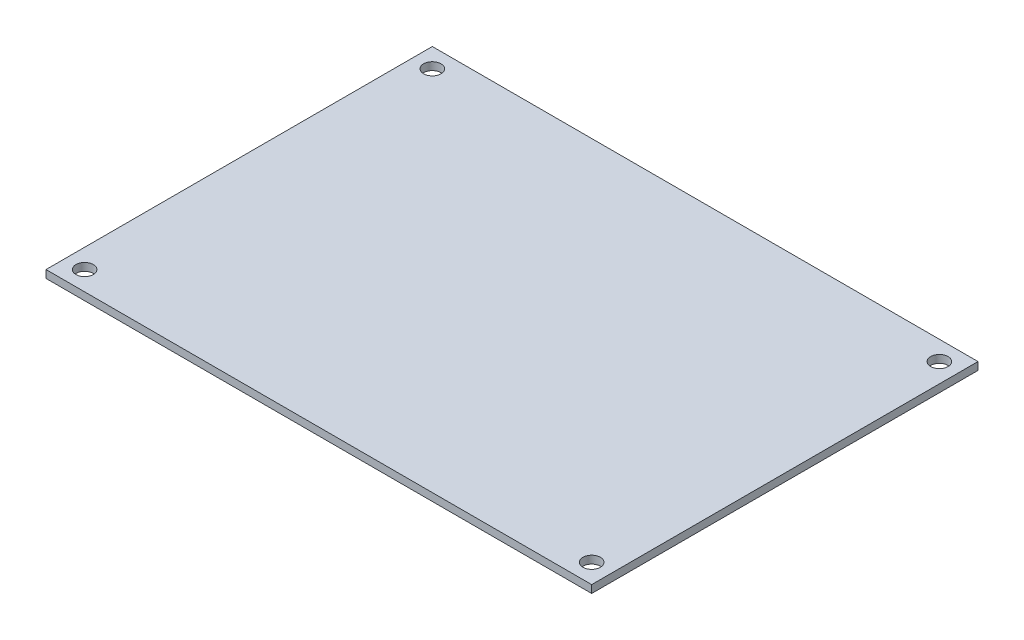
ISO-10303-21;
HEADER;
FILE_DESCRIPTION(('STEP AP214'),'2;1');
FILE_NAME('part.step','',(''),(''),'','','');
FILE_SCHEMA(('AUTOMOTIVE_DESIGN { 1 0 10303 214 1 1 1 1 }'));
ENDSEC;
DATA;
#1=APPLICATION_CONTEXT('core data for automotive mechanical design processes');
#2=APPLICATION_PROTOCOL_DEFINITION('international standard','automotive_design',2000,#1);
#3=PRODUCT_CONTEXT('',#1,'mechanical');
#4=PRODUCT('Part','Part','',(#3));
#5=PRODUCT_RELATED_PRODUCT_CATEGORY('part','',(#4));
#6=PRODUCT_DEFINITION_FORMATION('','',#4);
#7=PRODUCT_DEFINITION_CONTEXT('part definition',#1,'design');
#8=PRODUCT_DEFINITION('design','',#6,#7);
#9=PRODUCT_DEFINITION_SHAPE('','',#8);
#10=(LENGTH_UNIT() NAMED_UNIT(*) SI_UNIT(.MILLI.,.METRE.));
#11=(NAMED_UNIT(*) PLANE_ANGLE_UNIT() SI_UNIT($,.RADIAN.));
#12=(NAMED_UNIT(*) SI_UNIT($,.STERADIAN.) SOLID_ANGLE_UNIT());
#13=UNCERTAINTY_MEASURE_WITH_UNIT(LENGTH_MEASURE(1.E-05),#10,'distance_accuracy_value','');
#14=(GEOMETRIC_REPRESENTATION_CONTEXT(3) GLOBAL_UNCERTAINTY_ASSIGNED_CONTEXT((#13)) GLOBAL_UNIT_ASSIGNED_CONTEXT((#10,
#11,#12)) REPRESENTATION_CONTEXT('',''));
#15=CARTESIAN_POINT('',(0.,0.,0.));
#16=DIRECTION('',(0.,0.,1.));
#17=DIRECTION('',(1.,0.,0.));
#18=AXIS2_PLACEMENT_3D('',#15,#16,#17);
#19=CARTESIAN_POINT('',(56.5,1.6,-40.));
#20=DIRECTION('',(-1.,0.,0.));
#21=DIRECTION('',(0.,0.,1.));
#22=AXIS2_PLACEMENT_3D('',#19,#20,#21);
#23=PLANE('',#22);
#24=DIRECTION('',(0.,0.,-1.));
#25=VECTOR('',#24,1.);
#26=CARTESIAN_POINT('',(56.5,0.,-40.));
#27=LINE('',#26,#25);
#28=CARTESIAN_POINT('',(56.5,0.,40.));
#29=VERTEX_POINT('',#28);
#30=CARTESIAN_POINT('',(56.5,0.,-40.));
#31=VERTEX_POINT('',#30);
#32=EDGE_CURVE('E96',#29,#31,#27,.T.);
#33=ORIENTED_EDGE('',*,*,#32,.T.);
#34=DIRECTION('',(0.,-1.,0.));
#35=VECTOR('',#34,1.);
#36=CARTESIAN_POINT('',(56.5,1.6,-40.));
#37=LINE('',#36,#35);
#38=CARTESIAN_POINT('',(56.5,1.6,-40.));
#39=VERTEX_POINT('',#38);
#40=EDGE_CURVE('E11',#39,#31,#37,.T.);
#41=ORIENTED_EDGE('',*,*,#40,.F.);
#42=DIRECTION('',(0.,0.,-1.));
#43=VECTOR('',#42,1.);
#44=CARTESIAN_POINT('',(56.5,1.6,-40.));
#45=LINE('',#44,#43);
#46=CARTESIAN_POINT('',(56.5,1.6,40.));
#47=VERTEX_POINT('',#46);
#48=EDGE_CURVE('E84',#47,#39,#45,.T.);
#49=ORIENTED_EDGE('',*,*,#48,.F.);
#50=DIRECTION('',(0.,-1.,0.));
#51=VECTOR('',#50,1.);
#52=CARTESIAN_POINT('',(56.5,1.6,40.));
#53=LINE('',#52,#51);
#54=EDGE_CURVE('E92',#47,#29,#53,.T.);
#55=ORIENTED_EDGE('',*,*,#54,.T.);
#56=EDGE_LOOP('',(#33,#41,#49,#55));
#57=FACE_BOUND('',#56,.T.);
#58=ADVANCED_FACE('F33',(#57),#23,.F.);
#59=CARTESIAN_POINT('',(-56.5,1.6,-40.));
#60=DIRECTION('',(0.,0.,1.));
#61=DIRECTION('',(1.,0.,0.));
#62=AXIS2_PLACEMENT_3D('',#59,#60,#61);
#63=PLANE('',#62);
#64=DIRECTION('',(-1.,0.,0.));
#65=VECTOR('',#64,1.);
#66=CARTESIAN_POINT('',(-56.5,0.,-40.));
#67=LINE('',#66,#65);
#68=CARTESIAN_POINT('',(-56.5,0.,-40.));
#69=VERTEX_POINT('',#68);
#70=EDGE_CURVE('E88',#31,#69,#67,.T.);
#71=ORIENTED_EDGE('',*,*,#70,.T.);
#72=DIRECTION('',(0.,-1.,0.));
#73=VECTOR('',#72,1.);
#74=CARTESIAN_POINT('',(-56.5,1.6,-40.));
#75=LINE('',#74,#73);
#76=CARTESIAN_POINT('',(-56.5,1.6,-40.));
#77=VERTEX_POINT('',#76);
#78=EDGE_CURVE('E41',#77,#69,#75,.T.);
#79=ORIENTED_EDGE('',*,*,#78,.F.);
#80=DIRECTION('',(-1.,0.,0.));
#81=VECTOR('',#80,1.);
#82=CARTESIAN_POINT('',(-56.5,1.6,-40.));
#83=LINE('',#82,#81);
#84=EDGE_CURVE('E79',#39,#77,#83,.T.);
#85=ORIENTED_EDGE('',*,*,#84,.F.);
#86=ORIENTED_EDGE('',*,*,#40,.T.);
#87=EDGE_LOOP('',(#71,#79,#85,#86));
#88=FACE_BOUND('',#87,.T.);
#89=ADVANCED_FACE('F87',(#88),#63,.F.);
#90=CARTESIAN_POINT('',(-56.5,1.6,-40.));
#91=DIRECTION('',(1.,0.,0.));
#92=DIRECTION('',(0.,0.,-1.));
#93=AXIS2_PLACEMENT_3D('',#90,#91,#92);
#94=PLANE('',#93);
#95=DIRECTION('',(0.,0.,1.));
#96=VECTOR('',#95,1.);
#97=CARTESIAN_POINT('',(-56.5,0.,-40.));
#98=LINE('',#97,#96);
#99=CARTESIAN_POINT('',(-56.5,0.,40.));
#100=VERTEX_POINT('',#99);
#101=EDGE_CURVE('E66',#69,#100,#98,.T.);
#102=ORIENTED_EDGE('',*,*,#101,.T.);
#103=DIRECTION('',(0.,-1.,0.));
#104=VECTOR('',#103,1.);
#105=CARTESIAN_POINT('',(-56.5,1.6,40.));
#106=LINE('',#105,#104);
#107=CARTESIAN_POINT('',(-56.5,1.6,40.));
#108=VERTEX_POINT('',#107);
#109=EDGE_CURVE('E89',#108,#100,#106,.T.);
#110=ORIENTED_EDGE('',*,*,#109,.F.);
#111=DIRECTION('',(0.,0.,1.));
#112=VECTOR('',#111,1.);
#113=CARTESIAN_POINT('',(-56.5,1.6,-40.));
#114=LINE('',#113,#112);
#115=EDGE_CURVE('E82',#77,#108,#114,.T.);
#116=ORIENTED_EDGE('',*,*,#115,.F.);
#117=ORIENTED_EDGE('',*,*,#78,.T.);
#118=EDGE_LOOP('',(#102,#110,#116,#117));
#119=FACE_BOUND('',#118,.T.);
#120=ADVANCED_FACE('F90',(#119),#94,.F.);
#121=CARTESIAN_POINT('',(-56.5,1.6,40.));
#122=DIRECTION('',(0.,0.,-1.));
#123=DIRECTION('',(-1.,0.,0.));
#124=AXIS2_PLACEMENT_3D('',#121,#122,#123);
#125=PLANE('',#124);
#126=DIRECTION('',(1.,0.,0.));
#127=VECTOR('',#126,1.);
#128=CARTESIAN_POINT('',(-56.5,0.,40.));
#129=LINE('',#128,#127);
#130=EDGE_CURVE('E72',#100,#29,#129,.T.);
#131=ORIENTED_EDGE('',*,*,#130,.T.);
#132=ORIENTED_EDGE('',*,*,#54,.F.);
#133=DIRECTION('',(1.,0.,0.));
#134=VECTOR('',#133,1.);
#135=CARTESIAN_POINT('',(-56.5,1.6,40.));
#136=LINE('',#135,#134);
#137=EDGE_CURVE('E49',#108,#47,#136,.T.);
#138=ORIENTED_EDGE('',*,*,#137,.F.);
#139=ORIENTED_EDGE('',*,*,#109,.T.);
#140=EDGE_LOOP('',(#131,#132,#138,#139));
#141=FACE_BOUND('',#140,.T.);
#142=ADVANCED_FACE('F104',(#141),#125,.F.);
#143=CARTESIAN_POINT('',(0.,1.6,0.));
#144=DIRECTION('',(0.,1.,0.));
#145=DIRECTION('',(0.,0.,1.));
#146=AXIS2_PLACEMENT_3D('',#143,#144,#145);
#147=PLANE('',#146);
#148=CARTESIAN_POINT('',(52.5,1.6,36.));
#149=DIRECTION('',(0.,1.,0.));
#150=DIRECTION('',(0.,0.,1.));
#151=AXIS2_PLACEMENT_3D('',#148,#149,#150);
#152=CIRCLE('',#151,1.8);
#153=CARTESIAN_POINT('',(52.5,1.6,37.8));
#154=VERTEX_POINT('',#153);
#155=EDGE_CURVE('E130',#154,#154,#152,.T.);
#156=ORIENTED_EDGE('',*,*,#155,.F.);
#157=EDGE_LOOP('',(#156));
#158=FACE_BOUND('',#157,.T.);
#159=CARTESIAN_POINT('',(-52.5,1.6,36.));
#160=DIRECTION('',(0.,1.,0.));
#161=DIRECTION('',(0.,0.,1.));
#162=AXIS2_PLACEMENT_3D('',#159,#160,#161);
#163=CIRCLE('',#162,1.8);
#164=CARTESIAN_POINT('',(-52.5,1.6,37.8));
#165=VERTEX_POINT('',#164);
#166=EDGE_CURVE('E124',#165,#165,#163,.T.);
#167=ORIENTED_EDGE('',*,*,#166,.F.);
#168=EDGE_LOOP('',(#167));
#169=FACE_BOUND('',#168,.T.);
#170=CARTESIAN_POINT('',(52.5,1.6,-36.));
#171=DIRECTION('',(0.,1.,0.));
#172=DIRECTION('',(0.,0.,1.));
#173=AXIS2_PLACEMENT_3D('',#170,#171,#172);
#174=CIRCLE('',#173,1.8);
#175=CARTESIAN_POINT('',(52.5,1.6,-34.2));
#176=VERTEX_POINT('',#175);
#177=EDGE_CURVE('E118',#176,#176,#174,.T.);
#178=ORIENTED_EDGE('',*,*,#177,.F.);
#179=EDGE_LOOP('',(#178));
#180=FACE_BOUND('',#179,.T.);
#181=CARTESIAN_POINT('',(-52.5,1.6,-36.));
#182=DIRECTION('',(0.,1.,0.));
#183=DIRECTION('',(0.,0.,1.));
#184=AXIS2_PLACEMENT_3D('',#181,#182,#183);
#185=CIRCLE('',#184,1.8);
#186=CARTESIAN_POINT('',(-52.5,1.6,-34.2));
#187=VERTEX_POINT('',#186);
#188=EDGE_CURVE('E112',#187,#187,#185,.T.);
#189=ORIENTED_EDGE('',*,*,#188,.F.);
#190=EDGE_LOOP('',(#189));
#191=FACE_BOUND('',#190,.T.);
#192=ORIENTED_EDGE('',*,*,#48,.T.);
#193=ORIENTED_EDGE('',*,*,#84,.T.);
#194=ORIENTED_EDGE('',*,*,#115,.T.);
#195=ORIENTED_EDGE('',*,*,#137,.T.);
#196=EDGE_LOOP('',(#192,#193,#194,#195));
#197=FACE_BOUND('',#196,.T.);
#198=ADVANCED_FACE('F80',(#158,#169,#180,#191,#197),#147,.T.);
#199=CARTESIAN_POINT('',(0.,0.,0.));
#200=DIRECTION('',(0.,1.,0.));
#201=DIRECTION('',(0.,0.,1.));
#202=AXIS2_PLACEMENT_3D('',#199,#200,#201);
#203=PLANE('',#202);
#204=CARTESIAN_POINT('',(52.5,0.,36.));
#205=DIRECTION('',(0.,1.,0.));
#206=DIRECTION('',(0.,0.,1.));
#207=AXIS2_PLACEMENT_3D('',#204,#205,#206);
#208=CIRCLE('',#207,1.8);
#209=CARTESIAN_POINT('',(52.5,0.,37.8));
#210=VERTEX_POINT('',#209);
#211=EDGE_CURVE('E127',#210,#210,#208,.T.);
#212=ORIENTED_EDGE('',*,*,#211,.T.);
#213=EDGE_LOOP('',(#212));
#214=FACE_BOUND('',#213,.T.);
#215=CARTESIAN_POINT('',(-52.5,0.,36.));
#216=DIRECTION('',(0.,1.,0.));
#217=DIRECTION('',(0.,0.,1.));
#218=AXIS2_PLACEMENT_3D('',#215,#216,#217);
#219=CIRCLE('',#218,1.8);
#220=CARTESIAN_POINT('',(-52.5,0.,37.8));
#221=VERTEX_POINT('',#220);
#222=EDGE_CURVE('E121',#221,#221,#219,.T.);
#223=ORIENTED_EDGE('',*,*,#222,.T.);
#224=EDGE_LOOP('',(#223));
#225=FACE_BOUND('',#224,.T.);
#226=CARTESIAN_POINT('',(52.5,0.,-36.));
#227=DIRECTION('',(0.,1.,0.));
#228=DIRECTION('',(0.,0.,1.));
#229=AXIS2_PLACEMENT_3D('',#226,#227,#228);
#230=CIRCLE('',#229,1.8);
#231=CARTESIAN_POINT('',(52.5,0.,-34.2));
#232=VERTEX_POINT('',#231);
#233=EDGE_CURVE('E115',#232,#232,#230,.T.);
#234=ORIENTED_EDGE('',*,*,#233,.T.);
#235=EDGE_LOOP('',(#234));
#236=FACE_BOUND('',#235,.T.);
#237=CARTESIAN_POINT('',(-52.5,0.,-36.));
#238=DIRECTION('',(0.,1.,0.));
#239=DIRECTION('',(0.,0.,1.));
#240=AXIS2_PLACEMENT_3D('',#237,#238,#239);
#241=CIRCLE('',#240,1.8);
#242=CARTESIAN_POINT('',(-52.5,0.,-34.2));
#243=VERTEX_POINT('',#242);
#244=EDGE_CURVE('E99',#243,#243,#241,.T.);
#245=ORIENTED_EDGE('',*,*,#244,.T.);
#246=EDGE_LOOP('',(#245));
#247=FACE_BOUND('',#246,.T.);
#248=ORIENTED_EDGE('',*,*,#32,.F.);
#249=ORIENTED_EDGE('',*,*,#130,.F.);
#250=ORIENTED_EDGE('',*,*,#101,.F.);
#251=ORIENTED_EDGE('',*,*,#70,.F.);
#252=EDGE_LOOP('',(#248,#249,#250,#251));
#253=FACE_BOUND('',#252,.T.);
#254=ADVANCED_FACE('F107',(#214,#225,#236,#247,#253),#203,.F.);
#255=CARTESIAN_POINT('',(-52.5,1.6,-36.));
#256=DIRECTION('',(0.,1.,0.));
#257=DIRECTION('',(0.,0.,1.));
#258=AXIS2_PLACEMENT_3D('',#255,#256,#257);
#259=CYLINDRICAL_SURFACE('',#258,1.8);
#260=ORIENTED_EDGE('',*,*,#244,.F.);
#261=EDGE_LOOP('',(#260));
#262=FACE_BOUND('',#261,.T.);
#263=ORIENTED_EDGE('',*,*,#188,.T.);
#264=EDGE_LOOP('',(#263));
#265=FACE_BOUND('',#264,.T.);
#266=ADVANCED_FACE('F145',(#262,#265),#259,.F.);
#267=CARTESIAN_POINT('',(52.5,1.6,-36.));
#268=DIRECTION('',(0.,1.,0.));
#269=DIRECTION('',(0.,0.,1.));
#270=AXIS2_PLACEMENT_3D('',#267,#268,#269);
#271=CYLINDRICAL_SURFACE('',#270,1.8);
#272=ORIENTED_EDGE('',*,*,#233,.F.);
#273=EDGE_LOOP('',(#272));
#274=FACE_BOUND('',#273,.T.);
#275=ORIENTED_EDGE('',*,*,#177,.T.);
#276=EDGE_LOOP('',(#275));
#277=FACE_BOUND('',#276,.T.);
#278=ADVANCED_FACE('F147',(#274,#277),#271,.F.);
#279=CARTESIAN_POINT('',(-52.5,1.6,36.));
#280=DIRECTION('',(0.,1.,0.));
#281=DIRECTION('',(0.,0.,1.));
#282=AXIS2_PLACEMENT_3D('',#279,#280,#281);
#283=CYLINDRICAL_SURFACE('',#282,1.8);
#284=ORIENTED_EDGE('',*,*,#222,.F.);
#285=EDGE_LOOP('',(#284));
#286=FACE_BOUND('',#285,.T.);
#287=ORIENTED_EDGE('',*,*,#166,.T.);
#288=EDGE_LOOP('',(#287));
#289=FACE_BOUND('',#288,.T.);
#290=ADVANCED_FACE('F154',(#286,#289),#283,.F.);
#291=CARTESIAN_POINT('',(52.5,1.6,36.));
#292=DIRECTION('',(0.,1.,0.));
#293=DIRECTION('',(0.,0.,1.));
#294=AXIS2_PLACEMENT_3D('',#291,#292,#293);
#295=CYLINDRICAL_SURFACE('',#294,1.8);
#296=ORIENTED_EDGE('',*,*,#211,.F.);
#297=EDGE_LOOP('',(#296));
#298=FACE_BOUND('',#297,.T.);
#299=ORIENTED_EDGE('',*,*,#155,.T.);
#300=EDGE_LOOP('',(#299));
#301=FACE_BOUND('',#300,.T.);
#302=ADVANCED_FACE('F134',(#298,#301),#295,.F.);
#303=CLOSED_SHELL('',(#58,#89,#120,#142,#198,#254,#266,#278,#290,#302));
#304=MANIFOLD_SOLID_BREP('B2',#303);
#305=ADVANCED_BREP_SHAPE_REPRESENTATION('',(#18,#304),#14);
#306=SHAPE_DEFINITION_REPRESENTATION(#9,#305);
ENDSEC;
END-ISO-10303-21;
